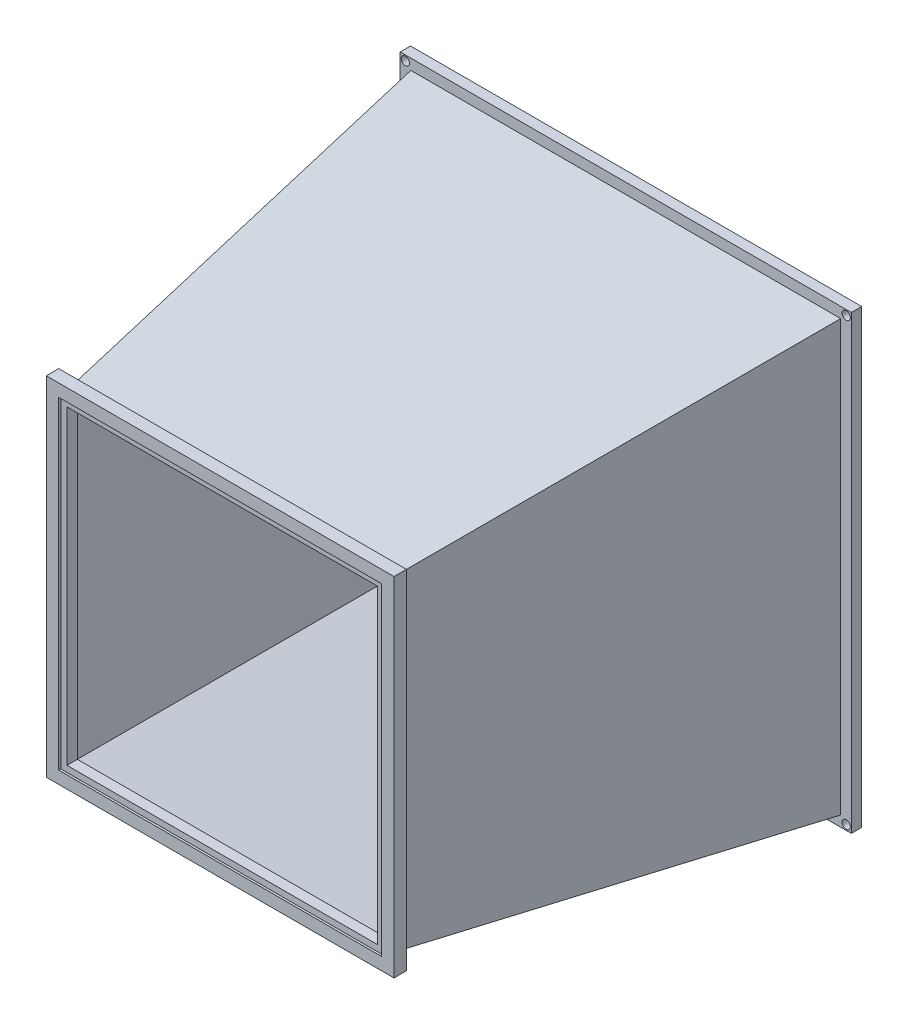
ISO-10303-21;
HEADER;
FILE_DESCRIPTION(('STEP AP214'),'2;1');
FILE_NAME('part.step','',(''),(''),'','','');
FILE_SCHEMA(('AUTOMOTIVE_DESIGN { 1 0 10303 214 1 1 1 1 }'));
ENDSEC;
DATA;
#1=APPLICATION_CONTEXT('core data for automotive mechanical design processes');
#2=APPLICATION_PROTOCOL_DEFINITION('international standard','automotive_design',2000,#1);
#3=PRODUCT_CONTEXT('',#1,'mechanical');
#4=PRODUCT('Part','Part','',(#3));
#5=PRODUCT_RELATED_PRODUCT_CATEGORY('part','',(#4));
#6=PRODUCT_DEFINITION_FORMATION('','',#4);
#7=PRODUCT_DEFINITION_CONTEXT('part definition',#1,'design');
#8=PRODUCT_DEFINITION('design','',#6,#7);
#9=PRODUCT_DEFINITION_SHAPE('','',#8);
#10=(LENGTH_UNIT() NAMED_UNIT(*) SI_UNIT(.MILLI.,.METRE.));
#11=(NAMED_UNIT(*) PLANE_ANGLE_UNIT() SI_UNIT($,.RADIAN.));
#12=(NAMED_UNIT(*) SI_UNIT($,.STERADIAN.) SOLID_ANGLE_UNIT());
#13=UNCERTAINTY_MEASURE_WITH_UNIT(LENGTH_MEASURE(1.E-05),#10,'distance_accuracy_value','');
#14=(GEOMETRIC_REPRESENTATION_CONTEXT(3) GLOBAL_UNCERTAINTY_ASSIGNED_CONTEXT((#13)) GLOBAL_UNIT_ASSIGNED_CONTEXT((#10,
#11,#12)) REPRESENTATION_CONTEXT('',''));
#15=CARTESIAN_POINT('',(0.,0.,0.));
#16=DIRECTION('',(0.,0.,1.));
#17=DIRECTION('',(1.,0.,0.));
#18=AXIS2_PLACEMENT_3D('',#15,#16,#17);
#19=CARTESIAN_POINT('',(0.,0.,0.));
#20=DIRECTION('',(0.,0.,1.));
#21=DIRECTION('',(1.,0.,0.));
#22=AXIS2_PLACEMENT_3D('',#19,#20,#21);
#23=PLANE('',#22);
#24=CARTESIAN_POINT('',(106.5,-106.5,0.));
#25=DIRECTION('',(0.,0.,1.));
#26=DIRECTION('',(1.,0.,0.));
#27=AXIS2_PLACEMENT_3D('',#24,#25,#26);
#28=CIRCLE('',#27,2.);
#29=CARTESIAN_POINT('',(108.5,-106.5,0.));
#30=VERTEX_POINT('',#29);
#31=EDGE_CURVE('E972',#30,#30,#28,.T.);
#32=ORIENTED_EDGE('',*,*,#31,.T.);
#33=EDGE_LOOP('',(#32));
#34=FACE_BOUND('',#33,.T.);
#35=CARTESIAN_POINT('',(-106.5,-106.5,0.));
#36=DIRECTION('',(0.,0.,1.));
#37=DIRECTION('',(1.,0.,0.));
#38=AXIS2_PLACEMENT_3D('',#35,#36,#37);
#39=CIRCLE('',#38,2.);
#40=CARTESIAN_POINT('',(-104.5,-106.5,0.));
#41=VERTEX_POINT('',#40);
#42=EDGE_CURVE('E974',#41,#41,#39,.T.);
#43=ORIENTED_EDGE('',*,*,#42,.T.);
#44=EDGE_LOOP('',(#43));
#45=FACE_BOUND('',#44,.T.);
#46=CARTESIAN_POINT('',(-106.5,106.5,0.));
#47=DIRECTION('',(0.,0.,1.));
#48=DIRECTION('',(1.,0.,0.));
#49=AXIS2_PLACEMENT_3D('',#46,#47,#48);
#50=CIRCLE('',#49,2.);
#51=CARTESIAN_POINT('',(-104.5,106.5,0.));
#52=VERTEX_POINT('',#51);
#53=EDGE_CURVE('E978',#52,#52,#50,.T.);
#54=ORIENTED_EDGE('',*,*,#53,.T.);
#55=EDGE_LOOP('',(#54));
#56=FACE_BOUND('',#55,.T.);
#57=CARTESIAN_POINT('',(106.5,106.5,0.));
#58=DIRECTION('',(0.,0.,1.));
#59=DIRECTION('',(1.,0.,0.));
#60=AXIS2_PLACEMENT_3D('',#57,#58,#59);
#61=CIRCLE('',#60,2.);
#62=CARTESIAN_POINT('',(108.5,106.5,0.));
#63=VERTEX_POINT('',#62);
#64=EDGE_CURVE('E513',#63,#63,#61,.T.);
#65=ORIENTED_EDGE('',*,*,#64,.T.);
#66=EDGE_LOOP('',(#65));
#67=FACE_BOUND('',#66,.T.);
#68=DIRECTION('',(0.,1.,0.));
#69=VECTOR('',#68,1.);
#70=CARTESIAN_POINT('',(-109.,109.,0.));
#71=LINE('',#70,#69);
#72=CARTESIAN_POINT('',(-109.,-109.,0.));
#73=VERTEX_POINT('',#72);
#74=CARTESIAN_POINT('',(-109.,109.,0.));
#75=VERTEX_POINT('',#74);
#76=EDGE_CURVE('E264',#73,#75,#71,.T.);
#77=ORIENTED_EDGE('',*,*,#76,.T.);
#78=DIRECTION('',(1.,0.,0.));
#79=VECTOR('',#78,1.);
#80=CARTESIAN_POINT('',(109.,109.,0.));
#81=LINE('',#80,#79);
#82=CARTESIAN_POINT('',(109.,109.,0.));
#83=VERTEX_POINT('',#82);
#84=EDGE_CURVE('E270',#75,#83,#81,.T.);
#85=ORIENTED_EDGE('',*,*,#84,.T.);
#86=DIRECTION('',(0.,-1.,0.));
#87=VECTOR('',#86,1.);
#88=CARTESIAN_POINT('',(109.,109.,0.));
#89=LINE('',#88,#87);
#90=CARTESIAN_POINT('',(109.,-109.,0.));
#91=VERTEX_POINT('',#90);
#92=EDGE_CURVE('E297',#83,#91,#89,.T.);
#93=ORIENTED_EDGE('',*,*,#92,.T.);
#94=DIRECTION('',(-1.,0.,0.));
#95=VECTOR('',#94,1.);
#96=CARTESIAN_POINT('',(109.,-109.,0.));
#97=LINE('',#96,#95);
#98=EDGE_CURVE('E281',#91,#73,#97,.T.);
#99=ORIENTED_EDGE('',*,*,#98,.T.);
#100=EDGE_LOOP('',(#77,#85,#93,#99));
#101=FACE_BOUND('',#100,.T.);
#102=DIRECTION('',(0.,1.,0.));
#103=VECTOR('',#102,1.);
#104=CARTESIAN_POINT('',(101.5,101.5,0.));
#105=LINE('',#104,#103);
#106=CARTESIAN_POINT('',(101.5,-101.5,0.));
#107=VERTEX_POINT('',#106);
#108=CARTESIAN_POINT('',(101.5,101.5,0.));
#109=VERTEX_POINT('',#108);
#110=EDGE_CURVE('E72',#107,#109,#105,.T.);
#111=ORIENTED_EDGE('',*,*,#110,.T.);
#112=DIRECTION('',(-1.,0.,0.));
#113=VECTOR('',#112,1.);
#114=CARTESIAN_POINT('',(-101.5,101.5,0.));
#115=LINE('',#114,#113);
#116=CARTESIAN_POINT('',(-101.5,101.5,0.));
#117=VERTEX_POINT('',#116);
#118=EDGE_CURVE('E262',#109,#117,#115,.T.);
#119=ORIENTED_EDGE('',*,*,#118,.T.);
#120=DIRECTION('',(0.,-1.,0.));
#121=VECTOR('',#120,1.);
#122=CARTESIAN_POINT('',(-101.5,101.5,0.));
#123=LINE('',#122,#121);
#124=CARTESIAN_POINT('',(-101.5,-101.5,0.));
#125=VERTEX_POINT('',#124);
#126=EDGE_CURVE('E530',#117,#125,#123,.T.);
#127=ORIENTED_EDGE('',*,*,#126,.T.);
#128=DIRECTION('',(1.,0.,0.));
#129=VECTOR('',#128,1.);
#130=CARTESIAN_POINT('',(-101.5,-101.5,0.));
#131=LINE('',#130,#129);
#132=EDGE_CURVE('E258',#125,#107,#131,.T.);
#133=ORIENTED_EDGE('',*,*,#132,.T.);
#134=EDGE_LOOP('',(#111,#119,#127,#133));
#135=FACE_BOUND('',#134,.T.);
#136=ADVANCED_FACE('F54',(#34,#45,#56,#67,#101,#135),#23,.F.);
#137=CARTESIAN_POINT('',(0.,102.722792764909,13.6107700413505));
#138=DIRECTION('',(0.,0.991335792784035,0.131351992543885));
#139=DIRECTION('',(0.,-0.131351992543885,0.991335792784035));
#140=AXIS2_PLACEMENT_3D('',#137,#138,#139);
#141=PLANE('',#140);
#142=DIRECTION('',(0.130233316898159,0.130233316898159,-0.982892957721952));
#143=VECTOR('',#142,1.);
#144=CARTESIAN_POINT('',(100.980540564807,100.980540564807,26.7598432496738));
#145=LINE('',#144,#143);
#146=CARTESIAN_POINT('',(78.6887197953883,78.6887197953883,195.));
#147=VERTEX_POINT('',#146);
#148=CARTESIAN_POINT('',(103.863719795388,103.863719795388,5.));
#149=VERTEX_POINT('',#148);
#150=EDGE_CURVE('E592',#147,#149,#145,.T.);
#151=ORIENTED_EDGE('',*,*,#150,.T.);
#152=DIRECTION('',(-1.,0.,0.));
#153=VECTOR('',#152,1.);
#154=CARTESIAN_POINT('',(0.,103.863719795388,5.));
#155=LINE('',#154,#153);
#156=CARTESIAN_POINT('',(-103.863719795388,103.863719795388,5.));
#157=VERTEX_POINT('',#156);
#158=EDGE_CURVE('E333',#149,#157,#155,.T.);
#159=ORIENTED_EDGE('',*,*,#158,.T.);
#160=DIRECTION('',(-0.130233316898159,0.130233316898159,-0.982892957721952));
#161=VECTOR('',#160,1.);
#162=CARTESIAN_POINT('',(-100.980540564807,100.980540564807,26.7598432496737));
#163=LINE('',#162,#161);
#164=CARTESIAN_POINT('',(-78.6887197953883,78.6887197953883,195.));
#165=VERTEX_POINT('',#164);
#166=EDGE_CURVE('E585',#165,#157,#163,.T.);
#167=ORIENTED_EDGE('',*,*,#166,.F.);
#168=DIRECTION('',(1.,0.,0.));
#169=VECTOR('',#168,1.);
#170=CARTESIAN_POINT('',(0.,78.6887197953883,195.));
#171=LINE('',#170,#169);
#172=EDGE_CURVE('E484',#165,#147,#171,.T.);
#173=ORIENTED_EDGE('',*,*,#172,.T.);
#174=EDGE_LOOP('',(#151,#159,#167,#173));
#175=FACE_BOUND('',#174,.T.);
#176=ADVANCED_FACE('F551',(#175),#141,.T.);
#177=CARTESIAN_POINT('',(-102.722792764909,0.,13.6107700413505));
#178=DIRECTION('',(-0.991335792784035,0.,0.131351992543885));
#179=DIRECTION('',(0.131351992543885,0.,0.991335792784035));
#180=AXIS2_PLACEMENT_3D('',#177,#178,#179);
#181=PLANE('',#180);
#182=ORIENTED_EDGE('',*,*,#166,.T.);
#183=DIRECTION('',(0.,-1.,0.));
#184=VECTOR('',#183,1.);
#185=CARTESIAN_POINT('',(-103.863719795388,0.,5.));
#186=LINE('',#185,#184);
#187=CARTESIAN_POINT('',(-103.863719795388,-103.863719795388,5.));
#188=VERTEX_POINT('',#187);
#189=EDGE_CURVE('E329',#157,#188,#186,.T.);
#190=ORIENTED_EDGE('',*,*,#189,.T.);
#191=DIRECTION('',(-0.130233316898159,-0.130233316898158,-0.982892957721952));
#192=VECTOR('',#191,1.);
#193=CARTESIAN_POINT('',(-100.980540564807,-100.980540564807,26.7598432496737));
#194=LINE('',#193,#192);
#195=CARTESIAN_POINT('',(-78.6887197953883,-78.6887197953883,195.));
#196=VERTEX_POINT('',#195);
#197=EDGE_CURVE('E584',#196,#188,#194,.T.);
#198=ORIENTED_EDGE('',*,*,#197,.F.);
#199=DIRECTION('',(0.,1.,0.));
#200=VECTOR('',#199,1.);
#201=CARTESIAN_POINT('',(-78.6887197953883,0.,195.));
#202=LINE('',#201,#200);
#203=EDGE_CURVE('E480',#196,#165,#202,.T.);
#204=ORIENTED_EDGE('',*,*,#203,.T.);
#205=EDGE_LOOP('',(#182,#190,#198,#204));
#206=FACE_BOUND('',#205,.T.);
#207=ADVANCED_FACE('F559',(#206),#181,.T.);
#208=CARTESIAN_POINT('',(102.722792764909,0.,13.6107700413505));
#209=DIRECTION('',(0.991335792784035,0.,0.131351992543885));
#210=DIRECTION('',(0.131351992543885,0.,-0.991335792784035));
#211=AXIS2_PLACEMENT_3D('',#208,#209,#210);
#212=PLANE('',#211);
#213=DIRECTION('',(0.130233316898159,-0.130233316898158,-0.982892957721952));
#214=VECTOR('',#213,1.);
#215=CARTESIAN_POINT('',(100.980540564807,-100.980540564807,26.7598432496737));
#216=LINE('',#215,#214);
#217=CARTESIAN_POINT('',(78.6887197953883,-78.6887197953883,195.));
#218=VERTEX_POINT('',#217);
#219=CARTESIAN_POINT('',(103.863719795388,-103.863719795388,5.));
#220=VERTEX_POINT('',#219);
#221=EDGE_CURVE('E580',#218,#220,#216,.T.);
#222=ORIENTED_EDGE('',*,*,#221,.T.);
#223=DIRECTION('',(0.,1.,0.));
#224=VECTOR('',#223,1.);
#225=CARTESIAN_POINT('',(103.863719795388,0.,5.));
#226=LINE('',#225,#224);
#227=EDGE_CURVE('E80',#220,#149,#226,.T.);
#228=ORIENTED_EDGE('',*,*,#227,.T.);
#229=ORIENTED_EDGE('',*,*,#150,.F.);
#230=DIRECTION('',(0.,-1.,0.));
#231=VECTOR('',#230,1.);
#232=CARTESIAN_POINT('',(78.6887197953883,0.,195.));
#233=LINE('',#232,#231);
#234=EDGE_CURVE('E476',#147,#218,#233,.T.);
#235=ORIENTED_EDGE('',*,*,#234,.T.);
#236=EDGE_LOOP('',(#222,#228,#229,#235));
#237=FACE_BOUND('',#236,.T.);
#238=ADVANCED_FACE('F569',(#237),#212,.T.);
#239=CARTESIAN_POINT('',(0.,-102.722792764909,13.6107700413505));
#240=DIRECTION('',(0.,-0.991335792784035,0.131351992543884));
#241=DIRECTION('',(0.,-0.131351992543884,-0.991335792784035));
#242=AXIS2_PLACEMENT_3D('',#239,#240,#241);
#243=PLANE('',#242);
#244=ORIENTED_EDGE('',*,*,#197,.T.);
#245=DIRECTION('',(1.,0.,0.));
#246=VECTOR('',#245,1.);
#247=CARTESIAN_POINT('',(0.,-103.863719795388,5.));
#248=LINE('',#247,#246);
#249=EDGE_CURVE('E324',#188,#220,#248,.T.);
#250=ORIENTED_EDGE('',*,*,#249,.T.);
#251=ORIENTED_EDGE('',*,*,#221,.F.);
#252=DIRECTION('',(-1.,0.,0.));
#253=VECTOR('',#252,1.);
#254=CARTESIAN_POINT('',(0.,-78.6887197953883,195.));
#255=LINE('',#254,#253);
#256=EDGE_CURVE('E472',#218,#196,#255,.T.);
#257=ORIENTED_EDGE('',*,*,#256,.T.);
#258=EDGE_LOOP('',(#244,#250,#251,#257));
#259=FACE_BOUND('',#258,.T.);
#260=ADVANCED_FACE('F56',(#259),#243,.T.);
#261=CARTESIAN_POINT('',(0.,99.7487853865572,13.2167140637188));
#262=DIRECTION('',(0.,0.991335792784035,0.131351992543885));
#263=DIRECTION('',(0.,-0.131351992543885,0.991335792784035));
#264=AXIS2_PLACEMENT_3D('',#261,#262,#263);
#265=PLANE('',#264);
#266=DIRECTION('',(-1.,0.,0.));
#267=VECTOR('',#266,1.);
#268=CARTESIAN_POINT('',(0.,100.8375,5.));
#269=LINE('',#268,#267);
#270=CARTESIAN_POINT('',(100.8375,100.8375,5.));
#271=VERTEX_POINT('',#270);
#272=CARTESIAN_POINT('',(-100.8375,100.8375,5.));
#273=VERTEX_POINT('',#272);
#274=EDGE_CURVE('E321',#271,#273,#269,.T.);
#275=ORIENTED_EDGE('',*,*,#274,.F.);
#276=DIRECTION('',(0.130233316898159,0.130233316898159,-0.982892957721952));
#277=VECTOR('',#276,1.);
#278=CARTESIAN_POINT('',(75.,75.,200.));
#279=LINE('',#278,#277);
#280=CARTESIAN_POINT('',(75.6625,75.6625,195.));
#281=VERTEX_POINT('',#280);
#282=EDGE_CURVE('E488',#281,#271,#279,.T.);
#283=ORIENTED_EDGE('',*,*,#282,.F.);
#284=DIRECTION('',(1.,0.,0.));
#285=VECTOR('',#284,1.);
#286=CARTESIAN_POINT('',(0.,75.6625,195.));
#287=LINE('',#286,#285);
#288=CARTESIAN_POINT('',(-75.6625,75.6625,195.));
#289=VERTEX_POINT('',#288);
#290=EDGE_CURVE('E468',#289,#281,#287,.T.);
#291=ORIENTED_EDGE('',*,*,#290,.F.);
#292=DIRECTION('',(-0.130233316898159,0.130233316898159,-0.982892957721952));
#293=VECTOR('',#292,1.);
#294=CARTESIAN_POINT('',(-75.,75.,200.));
#295=LINE('',#294,#293);
#296=EDGE_CURVE('E498',#289,#273,#295,.T.);
#297=ORIENTED_EDGE('',*,*,#296,.T.);
#298=EDGE_LOOP('',(#275,#283,#291,#297));
#299=FACE_BOUND('',#298,.T.);
#300=ADVANCED_FACE('F576',(#299),#265,.F.);
#301=CARTESIAN_POINT('',(-99.7487853865572,0.,13.2167140637188));
#302=DIRECTION('',(-0.991335792784035,0.,0.131351992543885));
#303=DIRECTION('',(0.131351992543885,0.,0.991335792784035));
#304=AXIS2_PLACEMENT_3D('',#301,#302,#303);
#305=PLANE('',#304);
#306=DIRECTION('',(0.,-1.,0.));
#307=VECTOR('',#306,1.);
#308=CARTESIAN_POINT('',(-100.8375,0.,5.));
#309=LINE('',#308,#307);
#310=CARTESIAN_POINT('',(-100.8375,-100.8375,5.));
#311=VERTEX_POINT('',#310);
#312=EDGE_CURVE('E318',#273,#311,#309,.T.);
#313=ORIENTED_EDGE('',*,*,#312,.F.);
#314=ORIENTED_EDGE('',*,*,#296,.F.);
#315=DIRECTION('',(0.,1.,0.));
#316=VECTOR('',#315,1.);
#317=CARTESIAN_POINT('',(-75.6625,0.,195.));
#318=LINE('',#317,#316);
#319=CARTESIAN_POINT('',(-75.6625,-75.6625,195.));
#320=VERTEX_POINT('',#319);
#321=EDGE_CURVE('E464',#320,#289,#318,.T.);
#322=ORIENTED_EDGE('',*,*,#321,.F.);
#323=DIRECTION('',(-0.130233316898159,-0.130233316898159,-0.982892957721952));
#324=VECTOR('',#323,1.);
#325=CARTESIAN_POINT('',(-75.,-75.,200.));
#326=LINE('',#325,#324);
#327=EDGE_CURVE('E595',#320,#311,#326,.T.);
#328=ORIENTED_EDGE('',*,*,#327,.T.);
#329=EDGE_LOOP('',(#313,#314,#322,#328));
#330=FACE_BOUND('',#329,.T.);
#331=ADVANCED_FACE('F699',(#330),#305,.F.);
#332=CARTESIAN_POINT('',(99.7487853865572,0.,13.2167140637189));
#333=DIRECTION('',(0.991335792784035,0.,0.131351992543885));
#334=DIRECTION('',(0.131351992543885,0.,-0.991335792784035));
#335=AXIS2_PLACEMENT_3D('',#332,#333,#334);
#336=PLANE('',#335);
#337=DIRECTION('',(0.,1.,0.));
#338=VECTOR('',#337,1.);
#339=CARTESIAN_POINT('',(100.8375,0.,5.));
#340=LINE('',#339,#338);
#341=CARTESIAN_POINT('',(100.8375,-100.8375,5.00000000000002));
#342=VERTEX_POINT('',#341);
#343=EDGE_CURVE('E307',#342,#271,#340,.T.);
#344=ORIENTED_EDGE('',*,*,#343,.F.);
#345=DIRECTION('',(0.130233316898159,-0.130233316898158,-0.982892957721952));
#346=VECTOR('',#345,1.);
#347=CARTESIAN_POINT('',(75.,-75.,200.));
#348=LINE('',#347,#346);
#349=CARTESIAN_POINT('',(75.6625,-75.6625,195.));
#350=VERTEX_POINT('',#349);
#351=EDGE_CURVE('E504',#350,#342,#348,.T.);
#352=ORIENTED_EDGE('',*,*,#351,.F.);
#353=DIRECTION('',(0.,-1.,0.));
#354=VECTOR('',#353,1.);
#355=CARTESIAN_POINT('',(75.6625,0.,195.));
#356=LINE('',#355,#354);
#357=EDGE_CURVE('E460',#281,#350,#356,.T.);
#358=ORIENTED_EDGE('',*,*,#357,.F.);
#359=ORIENTED_EDGE('',*,*,#282,.T.);
#360=EDGE_LOOP('',(#344,#352,#358,#359));
#361=FACE_BOUND('',#360,.T.);
#362=ADVANCED_FACE('F702',(#361),#336,.F.);
#363=CARTESIAN_POINT('',(0.,-99.7487853865572,13.2167140637188));
#364=DIRECTION('',(0.,-0.991335792784035,0.131351992543884));
#365=DIRECTION('',(0.,-0.131351992543884,-0.991335792784035));
#366=AXIS2_PLACEMENT_3D('',#363,#364,#365);
#367=PLANE('',#366);
#368=DIRECTION('',(1.,0.,0.));
#369=VECTOR('',#368,1.);
#370=CARTESIAN_POINT('',(0.,-100.8375,5.));
#371=LINE('',#370,#369);
#372=EDGE_CURVE('E12',#311,#342,#371,.T.);
#373=ORIENTED_EDGE('',*,*,#372,.F.);
#374=ORIENTED_EDGE('',*,*,#327,.F.);
#375=DIRECTION('',(-1.,0.,0.));
#376=VECTOR('',#375,1.);
#377=CARTESIAN_POINT('',(0.,-75.6625,195.));
#378=LINE('',#377,#376);
#379=EDGE_CURVE('E499',#350,#320,#378,.T.);
#380=ORIENTED_EDGE('',*,*,#379,.F.);
#381=ORIENTED_EDGE('',*,*,#351,.T.);
#382=EDGE_LOOP('',(#373,#374,#380,#381));
#383=FACE_BOUND('',#382,.T.);
#384=ADVANCED_FACE('F565',(#383),#367,.F.);
#385=CARTESIAN_POINT('',(75.,75.,205.));
#386=DIRECTION('',(-1.,0.,0.));
#387=DIRECTION('',(0.,0.,1.));
#388=AXIS2_PLACEMENT_3D('',#385,#386,#387);
#389=PLANE('',#388);
#390=DIRECTION('',(0.,0.,-1.));
#391=VECTOR('',#390,1.);
#392=CARTESIAN_POINT('',(75.,-75.,205.));
#393=LINE('',#392,#391);
#394=CARTESIAN_POINT('',(75.,-75.,200.));
#395=VERTEX_POINT('',#394);
#396=CARTESIAN_POINT('',(75.,-75.,195.));
#397=VERTEX_POINT('',#396);
#398=EDGE_CURVE('E407',#395,#397,#393,.T.);
#399=ORIENTED_EDGE('',*,*,#398,.F.);
#400=DIRECTION('',(0.,1.,0.));
#401=VECTOR('',#400,1.);
#402=CARTESIAN_POINT('',(75.,75.,200.));
#403=LINE('',#402,#401);
#404=CARTESIAN_POINT('',(75.,75.,200.));
#405=VERTEX_POINT('',#404);
#406=EDGE_CURVE('E387',#395,#405,#403,.T.);
#407=ORIENTED_EDGE('',*,*,#406,.T.);
#408=DIRECTION('',(0.,0.,-1.));
#409=VECTOR('',#408,1.);
#410=CARTESIAN_POINT('',(75.,75.,205.));
#411=LINE('',#410,#409);
#412=CARTESIAN_POINT('',(75.,75.,195.));
#413=VERTEX_POINT('',#412);
#414=EDGE_CURVE('E416',#405,#413,#411,.T.);
#415=ORIENTED_EDGE('',*,*,#414,.T.);
#416=DIRECTION('',(0.,1.,0.));
#417=VECTOR('',#416,1.);
#418=CARTESIAN_POINT('',(75.,75.,195.));
#419=LINE('',#418,#417);
#420=EDGE_CURVE('E391',#397,#413,#419,.T.);
#421=ORIENTED_EDGE('',*,*,#420,.F.);
#422=EDGE_LOOP('',(#399,#407,#415,#421));
#423=FACE_BOUND('',#422,.T.);
#424=ADVANCED_FACE('F670',(#423),#389,.T.);
#425=CARTESIAN_POINT('',(-75.,75.,205.));
#426=DIRECTION('',(0.,-1.,0.));
#427=DIRECTION('',(0.,0.,-1.));
#428=AXIS2_PLACEMENT_3D('',#425,#426,#427);
#429=PLANE('',#428);
#430=ORIENTED_EDGE('',*,*,#414,.F.);
#431=DIRECTION('',(-1.,0.,0.));
#432=VECTOR('',#431,1.);
#433=CARTESIAN_POINT('',(-75.,75.,200.));
#434=LINE('',#433,#432);
#435=CARTESIAN_POINT('',(-75.,75.,200.));
#436=VERTEX_POINT('',#435);
#437=EDGE_CURVE('E383',#405,#436,#434,.T.);
#438=ORIENTED_EDGE('',*,*,#437,.T.);
#439=DIRECTION('',(0.,0.,-1.));
#440=VECTOR('',#439,1.);
#441=CARTESIAN_POINT('',(-75.,75.,205.));
#442=LINE('',#441,#440);
#443=CARTESIAN_POINT('',(-75.,75.,195.));
#444=VERTEX_POINT('',#443);
#445=EDGE_CURVE('E413',#436,#444,#442,.T.);
#446=ORIENTED_EDGE('',*,*,#445,.T.);
#447=DIRECTION('',(-1.,0.,0.));
#448=VECTOR('',#447,1.);
#449=CARTESIAN_POINT('',(-75.,75.,195.));
#450=LINE('',#449,#448);
#451=EDGE_CURVE('E395',#413,#444,#450,.T.);
#452=ORIENTED_EDGE('',*,*,#451,.F.);
#453=EDGE_LOOP('',(#430,#438,#446,#452));
#454=FACE_BOUND('',#453,.T.);
#455=ADVANCED_FACE('F666',(#454),#429,.T.);
#456=CARTESIAN_POINT('',(-75.,75.,205.));
#457=DIRECTION('',(1.,0.,0.));
#458=DIRECTION('',(0.,1.,0.));
#459=AXIS2_PLACEMENT_3D('',#456,#457,#458);
#460=PLANE('',#459);
#461=ORIENTED_EDGE('',*,*,#445,.F.);
#462=DIRECTION('',(0.,-1.,0.));
#463=VECTOR('',#462,1.);
#464=CARTESIAN_POINT('',(-75.,75.,200.));
#465=LINE('',#464,#463);
#466=CARTESIAN_POINT('',(-75.,-75.,200.));
#467=VERTEX_POINT('',#466);
#468=EDGE_CURVE('E370',#436,#467,#465,.T.);
#469=ORIENTED_EDGE('',*,*,#468,.T.);
#470=DIRECTION('',(0.,0.,-1.));
#471=VECTOR('',#470,1.);
#472=CARTESIAN_POINT('',(-75.,-75.,205.));
#473=LINE('',#472,#471);
#474=CARTESIAN_POINT('',(-75.,-75.,195.));
#475=VERTEX_POINT('',#474);
#476=EDGE_CURVE('E410',#467,#475,#473,.T.);
#477=ORIENTED_EDGE('',*,*,#476,.T.);
#478=DIRECTION('',(0.,-1.,0.));
#479=VECTOR('',#478,1.);
#480=CARTESIAN_POINT('',(-75.,75.,195.));
#481=LINE('',#480,#479);
#482=EDGE_CURVE('E399',#444,#475,#481,.T.);
#483=ORIENTED_EDGE('',*,*,#482,.F.);
#484=EDGE_LOOP('',(#461,#469,#477,#483));
#485=FACE_BOUND('',#484,.T.);
#486=ADVANCED_FACE('F662',(#485),#460,.T.);
#487=CARTESIAN_POINT('',(-75.,-75.,205.));
#488=DIRECTION('',(0.,1.,0.));
#489=DIRECTION('',(0.,0.,1.));
#490=AXIS2_PLACEMENT_3D('',#487,#488,#489);
#491=PLANE('',#490);
#492=ORIENTED_EDGE('',*,*,#476,.F.);
#493=DIRECTION('',(1.,0.,0.));
#494=VECTOR('',#493,1.);
#495=CARTESIAN_POINT('',(-75.,-75.,200.));
#496=LINE('',#495,#494);
#497=EDGE_CURVE('E64',#467,#395,#496,.T.);
#498=ORIENTED_EDGE('',*,*,#497,.T.);
#499=ORIENTED_EDGE('',*,*,#398,.T.);
#500=DIRECTION('',(1.,0.,0.));
#501=VECTOR('',#500,1.);
#502=CARTESIAN_POINT('',(-75.,-75.,195.));
#503=LINE('',#502,#501);
#504=EDGE_CURVE('E403',#475,#397,#503,.T.);
#505=ORIENTED_EDGE('',*,*,#504,.F.);
#506=EDGE_LOOP('',(#492,#498,#499,#505));
#507=FACE_BOUND('',#506,.T.);
#508=ADVANCED_FACE('F658',(#507),#491,.T.);
#509=CARTESIAN_POINT('',(0.,0.,201.));
#510=DIRECTION('',(0.,0.,1.));
#511=DIRECTION('',(1.,0.,0.));
#512=AXIS2_PLACEMENT_3D('',#509,#510,#511);
#513=PLANE('',#512);
#514=DIRECTION('',(0.,-1.,0.));
#515=VECTOR('',#514,1.);
#516=CARTESIAN_POINT('',(-78.,78.,201.));
#517=LINE('',#516,#515);
#518=CARTESIAN_POINT('',(-78.,78.,201.));
#519=VERTEX_POINT('',#518);
#520=CARTESIAN_POINT('',(-78.,-78.,201.));
#521=VERTEX_POINT('',#520);
#522=EDGE_CURVE('E337',#519,#521,#517,.T.);
#523=ORIENTED_EDGE('',*,*,#522,.F.);
#524=DIRECTION('',(1.,0.,0.));
#525=VECTOR('',#524,1.);
#526=CARTESIAN_POINT('',(-78.,78.,201.));
#527=LINE('',#526,#525);
#528=CARTESIAN_POINT('',(78.,78.,201.));
#529=VERTEX_POINT('',#528);
#530=EDGE_CURVE('E343',#519,#529,#527,.T.);
#531=ORIENTED_EDGE('',*,*,#530,.T.);
#532=DIRECTION('',(0.,-1.,0.));
#533=VECTOR('',#532,1.);
#534=CARTESIAN_POINT('',(78.,78.,201.));
#535=LINE('',#534,#533);
#536=CARTESIAN_POINT('',(78.,-78.,201.));
#537=VERTEX_POINT('',#536);
#538=EDGE_CURVE('E360',#529,#537,#535,.T.);
#539=ORIENTED_EDGE('',*,*,#538,.T.);
#540=DIRECTION('',(1.,0.,0.));
#541=VECTOR('',#540,1.);
#542=CARTESIAN_POINT('',(-78.,-78.,201.));
#543=LINE('',#542,#541);
#544=EDGE_CURVE('E356',#521,#537,#543,.T.);
#545=ORIENTED_EDGE('',*,*,#544,.F.);
#546=EDGE_LOOP('',(#523,#531,#539,#545));
#547=FACE_BOUND('',#546,.T.);
#548=DIRECTION('',(0.,1.,0.));
#549=VECTOR('',#548,1.);
#550=CARTESIAN_POINT('',(83.9999999999999,84.,201.));
#551=LINE('',#550,#549);
#552=CARTESIAN_POINT('',(83.9999999999999,-84.,201.));
#553=VERTEX_POINT('',#552);
#554=CARTESIAN_POINT('',(83.9999999999999,84.,201.));
#555=VERTEX_POINT('',#554);
#556=EDGE_CURVE('E435',#553,#555,#551,.T.);
#557=ORIENTED_EDGE('',*,*,#556,.T.);
#558=DIRECTION('',(-1.,0.,0.));
#559=VECTOR('',#558,1.);
#560=CARTESIAN_POINT('',(-84.,84.,201.));
#561=LINE('',#560,#559);
#562=CARTESIAN_POINT('',(-84.,84.,201.));
#563=VERTEX_POINT('',#562);
#564=EDGE_CURVE('E439',#555,#563,#561,.T.);
#565=ORIENTED_EDGE('',*,*,#564,.T.);
#566=DIRECTION('',(0.,-1.,0.));
#567=VECTOR('',#566,1.);
#568=CARTESIAN_POINT('',(-84.,84.,201.));
#569=LINE('',#568,#567);
#570=CARTESIAN_POINT('',(-84.,-84.,201.));
#571=VERTEX_POINT('',#570);
#572=EDGE_CURVE('E442',#563,#571,#569,.T.);
#573=ORIENTED_EDGE('',*,*,#572,.T.);
#574=DIRECTION('',(1.,0.,0.));
#575=VECTOR('',#574,1.);
#576=CARTESIAN_POINT('',(-84.,-84.,201.));
#577=LINE('',#576,#575);
#578=EDGE_CURVE('E445',#571,#553,#577,.T.);
#579=ORIENTED_EDGE('',*,*,#578,.T.);
#580=EDGE_LOOP('',(#557,#565,#573,#579));
#581=FACE_BOUND('',#580,.T.);
#582=ADVANCED_FACE('F661',(#547,#581),#513,.T.);
#583=CARTESIAN_POINT('',(0.,0.,195.));
#584=DIRECTION('',(0.,0.,1.));
#585=DIRECTION('',(1.,0.,0.));
#586=AXIS2_PLACEMENT_3D('',#583,#584,#585);
#587=PLANE('',#586);
#588=ORIENTED_EDGE('',*,*,#504,.T.);
#589=ORIENTED_EDGE('',*,*,#420,.T.);
#590=ORIENTED_EDGE('',*,*,#451,.T.);
#591=ORIENTED_EDGE('',*,*,#482,.T.);
#592=EDGE_LOOP('',(#588,#589,#590,#591));
#593=FACE_BOUND('',#592,.T.);
#594=ORIENTED_EDGE('',*,*,#321,.T.);
#595=ORIENTED_EDGE('',*,*,#290,.T.);
#596=ORIENTED_EDGE('',*,*,#357,.T.);
#597=ORIENTED_EDGE('',*,*,#379,.T.);
#598=EDGE_LOOP('',(#594,#595,#596,#597));
#599=FACE_BOUND('',#598,.T.);
#600=ADVANCED_FACE('F678',(#593,#599),#587,.F.);
#601=CARTESIAN_POINT('',(83.9999999999999,84.,201.));
#602=DIRECTION('',(-1.,0.,0.));
#603=DIRECTION('',(0.,0.,1.));
#604=AXIS2_PLACEMENT_3D('',#601,#602,#603);
#605=PLANE('',#604);
#606=DIRECTION('',(0.,0.,-1.));
#607=VECTOR('',#606,1.);
#608=CARTESIAN_POINT('',(83.9999999999999,-84.,201.));
#609=LINE('',#608,#607);
#610=CARTESIAN_POINT('',(83.9999999999999,-84.,195.));
#611=VERTEX_POINT('',#610);
#612=EDGE_CURVE('E448',#553,#611,#609,.T.);
#613=ORIENTED_EDGE('',*,*,#612,.T.);
#614=DIRECTION('',(0.,1.,0.));
#615=VECTOR('',#614,1.);
#616=CARTESIAN_POINT('',(83.9999999999999,84.,195.));
#617=LINE('',#616,#615);
#618=CARTESIAN_POINT('',(83.9999999999999,84.,195.));
#619=VERTEX_POINT('',#618);
#620=EDGE_CURVE('E419',#611,#619,#617,.T.);
#621=ORIENTED_EDGE('',*,*,#620,.T.);
#622=DIRECTION('',(0.,0.,-1.));
#623=VECTOR('',#622,1.);
#624=CARTESIAN_POINT('',(83.9999999999999,84.,201.));
#625=LINE('',#624,#623);
#626=EDGE_CURVE('E457',#555,#619,#625,.T.);
#627=ORIENTED_EDGE('',*,*,#626,.F.);
#628=ORIENTED_EDGE('',*,*,#556,.F.);
#629=EDGE_LOOP('',(#613,#621,#627,#628));
#630=FACE_BOUND('',#629,.T.);
#631=ADVANCED_FACE('F692',(#630),#605,.F.);
#632=CARTESIAN_POINT('',(-84.,84.,201.));
#633=DIRECTION('',(0.,-1.,0.));
#634=DIRECTION('',(0.,0.,-1.));
#635=AXIS2_PLACEMENT_3D('',#632,#633,#634);
#636=PLANE('',#635);
#637=ORIENTED_EDGE('',*,*,#626,.T.);
#638=DIRECTION('',(-1.,0.,0.));
#639=VECTOR('',#638,1.);
#640=CARTESIAN_POINT('',(-84.,84.,195.));
#641=LINE('',#640,#639);
#642=CARTESIAN_POINT('',(-84.,84.,195.));
#643=VERTEX_POINT('',#642);
#644=EDGE_CURVE('E423',#619,#643,#641,.T.);
#645=ORIENTED_EDGE('',*,*,#644,.T.);
#646=DIRECTION('',(0.,0.,-1.));
#647=VECTOR('',#646,1.);
#648=CARTESIAN_POINT('',(-84.,84.,201.));
#649=LINE('',#648,#647);
#650=EDGE_CURVE('E454',#563,#643,#649,.T.);
#651=ORIENTED_EDGE('',*,*,#650,.F.);
#652=ORIENTED_EDGE('',*,*,#564,.F.);
#653=EDGE_LOOP('',(#637,#645,#651,#652));
#654=FACE_BOUND('',#653,.T.);
#655=ADVANCED_FACE('F688',(#654),#636,.F.);
#656=CARTESIAN_POINT('',(-84.,84.,201.));
#657=DIRECTION('',(1.,0.,0.));
#658=DIRECTION('',(0.,0.,-1.));
#659=AXIS2_PLACEMENT_3D('',#656,#657,#658);
#660=PLANE('',#659);
#661=ORIENTED_EDGE('',*,*,#650,.T.);
#662=DIRECTION('',(0.,-1.,0.));
#663=VECTOR('',#662,1.);
#664=CARTESIAN_POINT('',(-84.,84.,195.));
#665=LINE('',#664,#663);
#666=CARTESIAN_POINT('',(-84.,-84.,195.));
#667=VERTEX_POINT('',#666);
#668=EDGE_CURVE('E427',#643,#667,#665,.T.);
#669=ORIENTED_EDGE('',*,*,#668,.T.);
#670=DIRECTION('',(0.,0.,-1.));
#671=VECTOR('',#670,1.);
#672=CARTESIAN_POINT('',(-84.,-84.,201.));
#673=LINE('',#672,#671);
#674=EDGE_CURVE('E451',#571,#667,#673,.T.);
#675=ORIENTED_EDGE('',*,*,#674,.F.);
#676=ORIENTED_EDGE('',*,*,#572,.F.);
#677=EDGE_LOOP('',(#661,#669,#675,#676));
#678=FACE_BOUND('',#677,.T.);
#679=ADVANCED_FACE('F684',(#678),#660,.F.);
#680=CARTESIAN_POINT('',(-84.,-84.,201.));
#681=DIRECTION('',(0.,1.,0.));
#682=DIRECTION('',(-1.,0.,0.));
#683=AXIS2_PLACEMENT_3D('',#680,#681,#682);
#684=PLANE('',#683);
#685=ORIENTED_EDGE('',*,*,#674,.T.);
#686=DIRECTION('',(1.,0.,0.));
#687=VECTOR('',#686,1.);
#688=CARTESIAN_POINT('',(-84.,-84.,195.));
#689=LINE('',#688,#687);
#690=EDGE_CURVE('E431',#667,#611,#689,.T.);
#691=ORIENTED_EDGE('',*,*,#690,.T.);
#692=ORIENTED_EDGE('',*,*,#612,.F.);
#693=ORIENTED_EDGE('',*,*,#578,.F.);
#694=EDGE_LOOP('',(#685,#691,#692,#693));
#695=FACE_BOUND('',#694,.T.);
#696=ADVANCED_FACE('F677',(#695),#684,.F.);
#697=ORIENTED_EDGE('',*,*,#172,.F.);
#698=ORIENTED_EDGE('',*,*,#203,.F.);
#699=ORIENTED_EDGE('',*,*,#256,.F.);
#700=ORIENTED_EDGE('',*,*,#234,.F.);
#701=EDGE_LOOP('',(#697,#698,#699,#700));
#702=FACE_BOUND('',#701,.T.);
#703=ORIENTED_EDGE('',*,*,#620,.F.);
#704=ORIENTED_EDGE('',*,*,#690,.F.);
#705=ORIENTED_EDGE('',*,*,#668,.F.);
#706=ORIENTED_EDGE('',*,*,#644,.F.);
#707=EDGE_LOOP('',(#703,#704,#705,#706));
#708=FACE_BOUND('',#707,.T.);
#709=ADVANCED_FACE('F605',(#702,#708),#587,.F.);
#710=CARTESIAN_POINT('',(-78.,78.,200.));
#711=DIRECTION('',(-1.,0.,0.));
#712=DIRECTION('',(0.,-1.,0.));
#713=AXIS2_PLACEMENT_3D('',#710,#711,#712);
#714=PLANE('',#713);
#715=ORIENTED_EDGE('',*,*,#522,.T.);
#716=DIRECTION('',(0.,0.,1.));
#717=VECTOR('',#716,1.);
#718=CARTESIAN_POINT('',(-78.,-78.,200.));
#719=LINE('',#718,#717);
#720=CARTESIAN_POINT('',(-78.,-78.,200.));
#721=VERTEX_POINT('',#720);
#722=EDGE_CURVE('E353',#721,#521,#719,.T.);
#723=ORIENTED_EDGE('',*,*,#722,.F.);
#724=DIRECTION('',(0.,-1.,0.));
#725=VECTOR('',#724,1.);
#726=CARTESIAN_POINT('',(-78.,78.,200.));
#727=LINE('',#726,#725);
#728=CARTESIAN_POINT('',(-78.,78.,200.));
#729=VERTEX_POINT('',#728);
#730=EDGE_CURVE('E338',#729,#721,#727,.T.);
#731=ORIENTED_EDGE('',*,*,#730,.F.);
#732=DIRECTION('',(0.,0.,1.));
#733=VECTOR('',#732,1.);
#734=CARTESIAN_POINT('',(-78.,78.,200.));
#735=LINE('',#734,#733);
#736=EDGE_CURVE('E367',#729,#519,#735,.T.);
#737=ORIENTED_EDGE('',*,*,#736,.T.);
#738=EDGE_LOOP('',(#715,#723,#731,#737));
#739=FACE_BOUND('',#738,.T.);
#740=ADVANCED_FACE('F647',(#739),#714,.F.);
#741=CARTESIAN_POINT('',(-78.,78.,200.));
#742=DIRECTION('',(0.,-1.,0.));
#743=DIRECTION('',(0.,0.,-1.));
#744=AXIS2_PLACEMENT_3D('',#741,#742,#743);
#745=PLANE('',#744);
#746=ORIENTED_EDGE('',*,*,#530,.F.);
#747=ORIENTED_EDGE('',*,*,#736,.F.);
#748=DIRECTION('',(1.,0.,0.));
#749=VECTOR('',#748,1.);
#750=CARTESIAN_POINT('',(-78.,78.,200.));
#751=LINE('',#750,#749);
#752=CARTESIAN_POINT('',(78.,78.,200.));
#753=VERTEX_POINT('',#752);
#754=EDGE_CURVE('E350',#729,#753,#751,.T.);
#755=ORIENTED_EDGE('',*,*,#754,.T.);
#756=DIRECTION('',(0.,0.,1.));
#757=VECTOR('',#756,1.);
#758=CARTESIAN_POINT('',(78.,78.,200.));
#759=LINE('',#758,#757);
#760=EDGE_CURVE('E371',#753,#529,#759,.T.);
#761=ORIENTED_EDGE('',*,*,#760,.T.);
#762=EDGE_LOOP('',(#746,#747,#755,#761));
#763=FACE_BOUND('',#762,.T.);
#764=ADVANCED_FACE('F643',(#763),#745,.T.);
#765=CARTESIAN_POINT('',(78.,78.,200.));
#766=DIRECTION('',(-1.,0.,0.));
#767=DIRECTION('',(0.,-1.,0.));
#768=AXIS2_PLACEMENT_3D('',#765,#766,#767);
#769=PLANE('',#768);
#770=ORIENTED_EDGE('',*,*,#538,.F.);
#771=ORIENTED_EDGE('',*,*,#760,.F.);
#772=DIRECTION('',(0.,-1.,0.));
#773=VECTOR('',#772,1.);
#774=CARTESIAN_POINT('',(78.,78.,200.));
#775=LINE('',#774,#773);
#776=CARTESIAN_POINT('',(78.,-78.,200.));
#777=VERTEX_POINT('',#776);
#778=EDGE_CURVE('E347',#753,#777,#775,.T.);
#779=ORIENTED_EDGE('',*,*,#778,.T.);
#780=DIRECTION('',(0.,0.,1.));
#781=VECTOR('',#780,1.);
#782=CARTESIAN_POINT('',(78.,-78.,200.));
#783=LINE('',#782,#781);
#784=EDGE_CURVE('E374',#777,#537,#783,.T.);
#785=ORIENTED_EDGE('',*,*,#784,.T.);
#786=EDGE_LOOP('',(#770,#771,#779,#785));
#787=FACE_BOUND('',#786,.T.);
#788=ADVANCED_FACE('F646',(#787),#769,.T.);
#789=CARTESIAN_POINT('',(-78.,-78.,200.));
#790=DIRECTION('',(0.,-1.,0.));
#791=DIRECTION('',(0.,0.,-1.));
#792=AXIS2_PLACEMENT_3D('',#789,#790,#791);
#793=PLANE('',#792);
#794=ORIENTED_EDGE('',*,*,#544,.T.);
#795=ORIENTED_EDGE('',*,*,#784,.F.);
#796=DIRECTION('',(1.,0.,0.));
#797=VECTOR('',#796,1.);
#798=CARTESIAN_POINT('',(-78.,-78.,200.));
#799=LINE('',#798,#797);
#800=EDGE_CURVE('E342',#721,#777,#799,.T.);
#801=ORIENTED_EDGE('',*,*,#800,.F.);
#802=ORIENTED_EDGE('',*,*,#722,.T.);
#803=EDGE_LOOP('',(#794,#795,#801,#802));
#804=FACE_BOUND('',#803,.T.);
#805=ADVANCED_FACE('F637',(#804),#793,.F.);
#806=CARTESIAN_POINT('',(0.,0.,200.));
#807=DIRECTION('',(0.,0.,1.));
#808=DIRECTION('',(1.,0.,0.));
#809=AXIS2_PLACEMENT_3D('',#806,#807,#808);
#810=PLANE('',#809);
#811=ORIENTED_EDGE('',*,*,#497,.F.);
#812=ORIENTED_EDGE('',*,*,#468,.F.);
#813=ORIENTED_EDGE('',*,*,#437,.F.);
#814=ORIENTED_EDGE('',*,*,#406,.F.);
#815=EDGE_LOOP('',(#811,#812,#813,#814));
#816=FACE_BOUND('',#815,.T.);
#817=ORIENTED_EDGE('',*,*,#730,.T.);
#818=ORIENTED_EDGE('',*,*,#800,.T.);
#819=ORIENTED_EDGE('',*,*,#778,.F.);
#820=ORIENTED_EDGE('',*,*,#754,.F.);
#821=EDGE_LOOP('',(#817,#818,#819,#820));
#822=FACE_BOUND('',#821,.T.);
#823=ADVANCED_FACE('F630',(#816,#822),#810,.T.);
#824=CARTESIAN_POINT('',(-109.,109.,5.));
#825=DIRECTION('',(-1.,0.,0.));
#826=DIRECTION('',(0.,-1.,0.));
#827=AXIS2_PLACEMENT_3D('',#824,#825,#826);
#828=PLANE('',#827);
#829=ORIENTED_EDGE('',*,*,#76,.F.);
#830=DIRECTION('',(0.,0.,-1.));
#831=VECTOR('',#830,1.);
#832=CARTESIAN_POINT('',(-109.,-109.,5.));
#833=LINE('',#832,#831);
#834=CARTESIAN_POINT('',(-109.,-109.,5.));
#835=VERTEX_POINT('',#834);
#836=EDGE_CURVE('E304',#835,#73,#833,.T.);
#837=ORIENTED_EDGE('',*,*,#836,.F.);
#838=DIRECTION('',(0.,1.,0.));
#839=VECTOR('',#838,1.);
#840=CARTESIAN_POINT('',(-109.,109.,5.));
#841=LINE('',#840,#839);
#842=CARTESIAN_POINT('',(-109.,109.,5.));
#843=VERTEX_POINT('',#842);
#844=EDGE_CURVE('E276',#835,#843,#841,.T.);
#845=ORIENTED_EDGE('',*,*,#844,.T.);
#846=DIRECTION('',(0.,0.,-1.));
#847=VECTOR('',#846,1.);
#848=CARTESIAN_POINT('',(-109.,109.,5.));
#849=LINE('',#848,#847);
#850=EDGE_CURVE('E292',#843,#75,#849,.T.);
#851=ORIENTED_EDGE('',*,*,#850,.T.);
#852=EDGE_LOOP('',(#829,#837,#845,#851));
#853=FACE_BOUND('',#852,.T.);
#854=ADVANCED_FACE('F627',(#853),#828,.T.);
#855=CARTESIAN_POINT('',(109.,-109.,5.));
#856=DIRECTION('',(0.,-1.,0.));
#857=DIRECTION('',(0.,0.,-1.));
#858=AXIS2_PLACEMENT_3D('',#855,#856,#857);
#859=PLANE('',#858);
#860=ORIENTED_EDGE('',*,*,#98,.F.);
#861=DIRECTION('',(0.,0.,-1.));
#862=VECTOR('',#861,1.);
#863=CARTESIAN_POINT('',(109.,-109.,5.));
#864=LINE('',#863,#862);
#865=CARTESIAN_POINT('',(109.,-109.,5.));
#866=VERTEX_POINT('',#865);
#867=EDGE_CURVE('E308',#866,#91,#864,.T.);
#868=ORIENTED_EDGE('',*,*,#867,.F.);
#869=DIRECTION('',(-1.,0.,0.));
#870=VECTOR('',#869,1.);
#871=CARTESIAN_POINT('',(109.,-109.,5.));
#872=LINE('',#871,#870);
#873=EDGE_CURVE('E289',#866,#835,#872,.T.);
#874=ORIENTED_EDGE('',*,*,#873,.T.);
#875=ORIENTED_EDGE('',*,*,#836,.T.);
#876=EDGE_LOOP('',(#860,#868,#874,#875));
#877=FACE_BOUND('',#876,.T.);
#878=ADVANCED_FACE('F620',(#877),#859,.T.);
#879=CARTESIAN_POINT('',(109.,109.,5.));
#880=DIRECTION('',(1.,0.,0.));
#881=DIRECTION('',(0.,1.,0.));
#882=AXIS2_PLACEMENT_3D('',#879,#880,#881);
#883=PLANE('',#882);
#884=ORIENTED_EDGE('',*,*,#92,.F.);
#885=DIRECTION('',(0.,0.,-1.));
#886=VECTOR('',#885,1.);
#887=CARTESIAN_POINT('',(109.,109.,5.));
#888=LINE('',#887,#886);
#889=CARTESIAN_POINT('',(109.,109.,5.));
#890=VERTEX_POINT('',#889);
#891=EDGE_CURVE('E311',#890,#83,#888,.T.);
#892=ORIENTED_EDGE('',*,*,#891,.F.);
#893=DIRECTION('',(0.,-1.,0.));
#894=VECTOR('',#893,1.);
#895=CARTESIAN_POINT('',(109.,109.,5.));
#896=LINE('',#895,#894);
#897=EDGE_CURVE('E285',#890,#866,#896,.T.);
#898=ORIENTED_EDGE('',*,*,#897,.T.);
#899=ORIENTED_EDGE('',*,*,#867,.T.);
#900=EDGE_LOOP('',(#884,#892,#898,#899));
#901=FACE_BOUND('',#900,.T.);
#902=ADVANCED_FACE('F624',(#901),#883,.T.);
#903=CARTESIAN_POINT('',(109.,109.,5.));
#904=DIRECTION('',(0.,1.,0.));
#905=DIRECTION('',(0.,0.,1.));
#906=AXIS2_PLACEMENT_3D('',#903,#904,#905);
#907=PLANE('',#906);
#908=ORIENTED_EDGE('',*,*,#84,.F.);
#909=ORIENTED_EDGE('',*,*,#850,.F.);
#910=DIRECTION('',(1.,0.,0.));
#911=VECTOR('',#910,1.);
#912=CARTESIAN_POINT('',(109.,109.,5.));
#913=LINE('',#912,#911);
#914=EDGE_CURVE('E280',#843,#890,#913,.T.);
#915=ORIENTED_EDGE('',*,*,#914,.T.);
#916=ORIENTED_EDGE('',*,*,#891,.T.);
#917=EDGE_LOOP('',(#908,#909,#915,#916));
#918=FACE_BOUND('',#917,.T.);
#919=ADVANCED_FACE('F610',(#918),#907,.T.);
#920=CARTESIAN_POINT('',(0.,0.,5.));
#921=DIRECTION('',(0.,0.,-1.));
#922=DIRECTION('',(-1.,0.,0.));
#923=AXIS2_PLACEMENT_3D('',#920,#921,#922);
#924=PLANE('',#923);
#925=CARTESIAN_POINT('',(106.5,-106.5,5.));
#926=DIRECTION('',(0.,0.,-1.));
#927=DIRECTION('',(-1.,0.,0.));
#928=AXIS2_PLACEMENT_3D('',#925,#926,#927);
#929=CIRCLE('',#928,2.);
#930=CARTESIAN_POINT('',(104.5,-106.5,5.));
#931=VERTEX_POINT('',#930);
#932=EDGE_CURVE('E58',#931,#931,#929,.F.);
#933=ORIENTED_EDGE('',*,*,#932,.F.);
#934=EDGE_LOOP('',(#933));
#935=FACE_BOUND('',#934,.T.);
#936=CARTESIAN_POINT('',(-106.5,-106.5,5.));
#937=DIRECTION('',(0.,0.,-1.));
#938=DIRECTION('',(-1.,0.,0.));
#939=AXIS2_PLACEMENT_3D('',#936,#937,#938);
#940=CIRCLE('',#939,2.);
#941=CARTESIAN_POINT('',(-108.5,-106.5,5.));
#942=VERTEX_POINT('',#941);
#943=EDGE_CURVE('E516',#942,#942,#940,.F.);
#944=ORIENTED_EDGE('',*,*,#943,.F.);
#945=EDGE_LOOP('',(#944));
#946=FACE_BOUND('',#945,.T.);
#947=CARTESIAN_POINT('',(-106.5,106.5,5.));
#948=DIRECTION('',(0.,0.,-1.));
#949=DIRECTION('',(-1.,0.,0.));
#950=AXIS2_PLACEMENT_3D('',#947,#948,#949);
#951=CIRCLE('',#950,2.);
#952=CARTESIAN_POINT('',(-108.5,106.5,5.));
#953=VERTEX_POINT('',#952);
#954=EDGE_CURVE('E512',#953,#953,#951,.F.);
#955=ORIENTED_EDGE('',*,*,#954,.F.);
#956=EDGE_LOOP('',(#955));
#957=FACE_BOUND('',#956,.T.);
#958=CARTESIAN_POINT('',(106.5,106.5,5.));
#959=DIRECTION('',(0.,0.,-1.));
#960=DIRECTION('',(-1.,0.,0.));
#961=AXIS2_PLACEMENT_3D('',#958,#959,#960);
#962=CIRCLE('',#961,2.);
#963=CARTESIAN_POINT('',(104.5,106.5,5.));
#964=VERTEX_POINT('',#963);
#965=EDGE_CURVE('E508',#964,#964,#962,.F.);
#966=ORIENTED_EDGE('',*,*,#965,.F.);
#967=EDGE_LOOP('',(#966));
#968=FACE_BOUND('',#967,.T.);
#969=ORIENTED_EDGE('',*,*,#158,.F.);
#970=ORIENTED_EDGE('',*,*,#227,.F.);
#971=ORIENTED_EDGE('',*,*,#249,.F.);
#972=ORIENTED_EDGE('',*,*,#189,.F.);
#973=EDGE_LOOP('',(#969,#970,#971,#972));
#974=FACE_BOUND('',#973,.T.);
#975=ORIENTED_EDGE('',*,*,#844,.F.);
#976=ORIENTED_EDGE('',*,*,#873,.F.);
#977=ORIENTED_EDGE('',*,*,#897,.F.);
#978=ORIENTED_EDGE('',*,*,#914,.F.);
#979=EDGE_LOOP('',(#975,#976,#977,#978));
#980=FACE_BOUND('',#979,.T.);
#981=ADVANCED_FACE('F608',(#935,#946,#957,#968,#974,#980),#924,.F.);
#982=CARTESIAN_POINT('',(101.5,101.5,5.));
#983=DIRECTION('',(-1.,0.,0.));
#984=DIRECTION('',(0.,-1.,0.));
#985=AXIS2_PLACEMENT_3D('',#982,#983,#984);
#986=PLANE('',#985);
#987=ORIENTED_EDGE('',*,*,#110,.F.);
#988=DIRECTION('',(0.,0.,-1.));
#989=VECTOR('',#988,1.);
#990=CARTESIAN_POINT('',(101.5,-101.5,5.));
#991=LINE('',#990,#989);
#992=CARTESIAN_POINT('',(101.5,-101.5,5.));
#993=VERTEX_POINT('',#992);
#994=EDGE_CURVE('E256',#993,#107,#991,.T.);
#995=ORIENTED_EDGE('',*,*,#994,.F.);
#996=DIRECTION('',(0.,1.,0.));
#997=VECTOR('',#996,1.);
#998=CARTESIAN_POINT('',(101.5,101.5,5.));
#999=LINE('',#998,#997);
#1000=CARTESIAN_POINT('',(101.5,101.5,5.));
#1001=VERTEX_POINT('',#1000);
#1002=EDGE_CURVE('E247',#993,#1001,#999,.T.);
#1003=ORIENTED_EDGE('',*,*,#1002,.T.);
#1004=DIRECTION('',(0.,0.,-1.));
#1005=VECTOR('',#1004,1.);
#1006=CARTESIAN_POINT('',(101.5,101.5,5.));
#1007=LINE('',#1006,#1005);
#1008=EDGE_CURVE('E255',#1001,#109,#1007,.T.);
#1009=ORIENTED_EDGE('',*,*,#1008,.T.);
#1010=EDGE_LOOP('',(#987,#995,#1003,#1009));
#1011=FACE_BOUND('',#1010,.T.);
#1012=ADVANCED_FACE('F254',(#1011),#986,.T.);
#1013=CARTESIAN_POINT('',(-101.5,101.5,5.));
#1014=DIRECTION('',(0.,-1.,0.));
#1015=DIRECTION('',(0.,0.,-1.));
#1016=AXIS2_PLACEMENT_3D('',#1013,#1014,#1015);
#1017=PLANE('',#1016);
#1018=ORIENTED_EDGE('',*,*,#118,.F.);
#1019=ORIENTED_EDGE('',*,*,#1008,.F.);
#1020=DIRECTION('',(-1.,0.,0.));
#1021=VECTOR('',#1020,1.);
#1022=CARTESIAN_POINT('',(-101.5,101.5,5.));
#1023=LINE('',#1022,#1021);
#1024=CARTESIAN_POINT('',(-101.5,101.5,5.));
#1025=VERTEX_POINT('',#1024);
#1026=EDGE_CURVE('E243',#1001,#1025,#1023,.T.);
#1027=ORIENTED_EDGE('',*,*,#1026,.T.);
#1028=DIRECTION('',(0.,0.,-1.));
#1029=VECTOR('',#1028,1.);
#1030=CARTESIAN_POINT('',(-101.5,101.5,5.));
#1031=LINE('',#1030,#1029);
#1032=EDGE_CURVE('E265',#1025,#117,#1031,.T.);
#1033=ORIENTED_EDGE('',*,*,#1032,.T.);
#1034=EDGE_LOOP('',(#1018,#1019,#1027,#1033));
#1035=FACE_BOUND('',#1034,.T.);
#1036=ADVANCED_FACE('F260',(#1035),#1017,.T.);
#1037=CARTESIAN_POINT('',(-101.5,101.5,5.));
#1038=DIRECTION('',(1.,0.,0.));
#1039=DIRECTION('',(0.,1.,0.));
#1040=AXIS2_PLACEMENT_3D('',#1037,#1038,#1039);
#1041=PLANE('',#1040);
#1042=ORIENTED_EDGE('',*,*,#126,.F.);
#1043=ORIENTED_EDGE('',*,*,#1032,.F.);
#1044=DIRECTION('',(0.,-1.,0.));
#1045=VECTOR('',#1044,1.);
#1046=CARTESIAN_POINT('',(-101.5,101.5,5.));
#1047=LINE('',#1046,#1045);
#1048=CARTESIAN_POINT('',(-101.5,-101.5,5.));
#1049=VERTEX_POINT('',#1048);
#1050=EDGE_CURVE('E248',#1025,#1049,#1047,.T.);
#1051=ORIENTED_EDGE('',*,*,#1050,.T.);
#1052=DIRECTION('',(0.,0.,-1.));
#1053=VECTOR('',#1052,1.);
#1054=CARTESIAN_POINT('',(-101.5,-101.5,5.));
#1055=LINE('',#1054,#1053);
#1056=EDGE_CURVE('E272',#1049,#125,#1055,.T.);
#1057=ORIENTED_EDGE('',*,*,#1056,.T.);
#1058=EDGE_LOOP('',(#1042,#1043,#1051,#1057));
#1059=FACE_BOUND('',#1058,.T.);
#1060=ADVANCED_FACE('F547',(#1059),#1041,.T.);
#1061=CARTESIAN_POINT('',(-101.5,-101.5,5.));
#1062=DIRECTION('',(0.,1.,0.));
#1063=DIRECTION('',(0.,0.,1.));
#1064=AXIS2_PLACEMENT_3D('',#1061,#1062,#1063);
#1065=PLANE('',#1064);
#1066=ORIENTED_EDGE('',*,*,#132,.F.);
#1067=ORIENTED_EDGE('',*,*,#1056,.F.);
#1068=DIRECTION('',(1.,0.,0.));
#1069=VECTOR('',#1068,1.);
#1070=CARTESIAN_POINT('',(-101.5,-101.5,5.));
#1071=LINE('',#1070,#1069);
#1072=EDGE_CURVE('E533',#1049,#993,#1071,.T.);
#1073=ORIENTED_EDGE('',*,*,#1072,.T.);
#1074=ORIENTED_EDGE('',*,*,#994,.T.);
#1075=EDGE_LOOP('',(#1066,#1067,#1073,#1074));
#1076=FACE_BOUND('',#1075,.T.);
#1077=ADVANCED_FACE('F549',(#1076),#1065,.T.);
#1078=CARTESIAN_POINT('',(0.,0.,5.));
#1079=DIRECTION('',(0.,0.,1.));
#1080=DIRECTION('',(1.,0.,0.));
#1081=AXIS2_PLACEMENT_3D('',#1078,#1079,#1080);
#1082=PLANE('',#1081);
#1083=ORIENTED_EDGE('',*,*,#343,.T.);
#1084=ORIENTED_EDGE('',*,*,#274,.T.);
#1085=ORIENTED_EDGE('',*,*,#312,.T.);
#1086=ORIENTED_EDGE('',*,*,#372,.T.);
#1087=EDGE_LOOP('',(#1083,#1084,#1085,#1086));
#1088=FACE_BOUND('',#1087,.T.);
#1089=ORIENTED_EDGE('',*,*,#1002,.F.);
#1090=ORIENTED_EDGE('',*,*,#1072,.F.);
#1091=ORIENTED_EDGE('',*,*,#1050,.F.);
#1092=ORIENTED_EDGE('',*,*,#1026,.F.);
#1093=EDGE_LOOP('',(#1089,#1090,#1091,#1092));
#1094=FACE_BOUND('',#1093,.T.);
#1095=ADVANCED_FACE('F245',(#1088,#1094),#1082,.F.);
#1096=CARTESIAN_POINT('',(106.5,106.5,10.));
#1097=DIRECTION('',(0.,0.,-1.));
#1098=DIRECTION('',(-1.,0.,0.));
#1099=AXIS2_PLACEMENT_3D('',#1096,#1097,#1098);
#1100=CYLINDRICAL_SURFACE('',#1099,2.);
#1101=ORIENTED_EDGE('',*,*,#64,.F.);
#1102=EDGE_LOOP('',(#1101));
#1103=FACE_BOUND('',#1102,.T.);
#1104=ORIENTED_EDGE('',*,*,#965,.T.);
#1105=EDGE_LOOP('',(#1104));
#1106=FACE_BOUND('',#1105,.T.);
#1107=ADVANCED_FACE('F886',(#1103,#1106),#1100,.F.);
#1108=CARTESIAN_POINT('',(-106.5,106.5,10.));
#1109=DIRECTION('',(0.,0.,-1.));
#1110=DIRECTION('',(-1.,0.,0.));
#1111=AXIS2_PLACEMENT_3D('',#1108,#1109,#1110);
#1112=CYLINDRICAL_SURFACE('',#1111,2.);
#1113=ORIENTED_EDGE('',*,*,#53,.F.);
#1114=EDGE_LOOP('',(#1113));
#1115=FACE_BOUND('',#1114,.T.);
#1116=ORIENTED_EDGE('',*,*,#954,.T.);
#1117=EDGE_LOOP('',(#1116));
#1118=FACE_BOUND('',#1117,.T.);
#1119=ADVANCED_FACE('F898',(#1115,#1118),#1112,.F.);
#1120=CARTESIAN_POINT('',(-106.5,-106.5,10.));
#1121=DIRECTION('',(0.,0.,-1.));
#1122=DIRECTION('',(-1.,0.,0.));
#1123=AXIS2_PLACEMENT_3D('',#1120,#1121,#1122);
#1124=CYLINDRICAL_SURFACE('',#1123,2.);
#1125=ORIENTED_EDGE('',*,*,#42,.F.);
#1126=EDGE_LOOP('',(#1125));
#1127=FACE_BOUND('',#1126,.T.);
#1128=ORIENTED_EDGE('',*,*,#943,.T.);
#1129=EDGE_LOOP('',(#1128));
#1130=FACE_BOUND('',#1129,.T.);
#1131=ADVANCED_FACE('F908',(#1127,#1130),#1124,.F.);
#1132=CARTESIAN_POINT('',(106.5,-106.5,10.));
#1133=DIRECTION('',(0.,0.,-1.));
#1134=DIRECTION('',(-1.,0.,0.));
#1135=AXIS2_PLACEMENT_3D('',#1132,#1133,#1134);
#1136=CYLINDRICAL_SURFACE('',#1135,2.);
#1137=ORIENTED_EDGE('',*,*,#31,.F.);
#1138=EDGE_LOOP('',(#1137));
#1139=FACE_BOUND('',#1138,.T.);
#1140=ORIENTED_EDGE('',*,*,#932,.T.);
#1141=EDGE_LOOP('',(#1140));
#1142=FACE_BOUND('',#1141,.T.);
#1143=ADVANCED_FACE('F918',(#1139,#1142),#1136,.F.);
#1144=CLOSED_SHELL('',(#136,#176,#207,#238,#260,#300,#331,#362,#384,#424,#455,#486,#508,#582,
#600,#631,#655,#679,#696,#709,#740,#764,#788,#805,#823,#854,#878,#902,#919,#981,#1012,#1036,
#1060,#1077,#1095,#1107,#1119,#1131,#1143));
#1145=MANIFOLD_SOLID_BREP('B2',#1144);
#1146=ADVANCED_BREP_SHAPE_REPRESENTATION('',(#18,#1145),#14);
#1147=SHAPE_DEFINITION_REPRESENTATION(#9,#1146);
ENDSEC;
END-ISO-10303-21;
